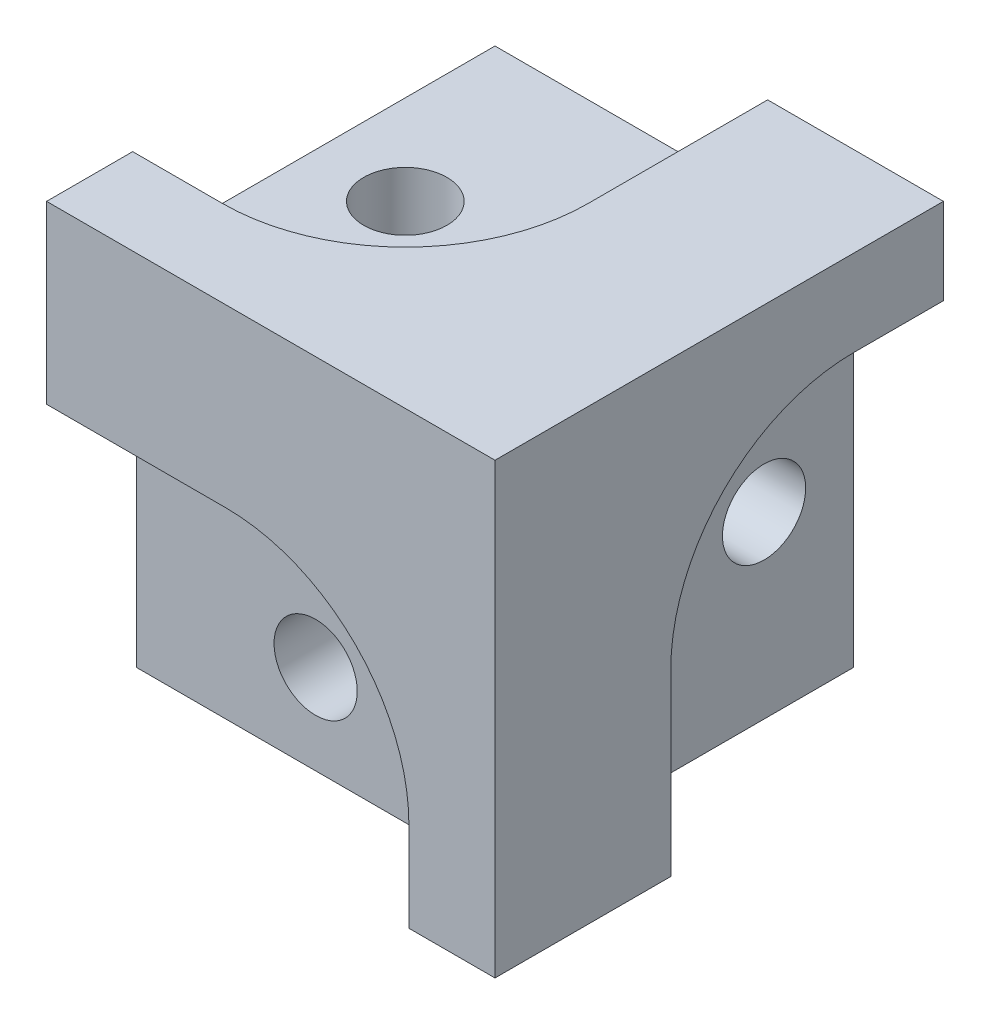
ISO-10303-21;
HEADER;
FILE_DESCRIPTION(('STEP AP214'),'2;1');
FILE_NAME('part.step','',(''),(''),'','','');
FILE_SCHEMA(('AUTOMOTIVE_DESIGN { 1 0 10303 214 1 1 1 1 }'));
ENDSEC;
DATA;
#1=APPLICATION_CONTEXT('core data for automotive mechanical design processes');
#2=APPLICATION_PROTOCOL_DEFINITION('international standard','automotive_design',2000,#1);
#3=PRODUCT_CONTEXT('',#1,'mechanical');
#4=PRODUCT('Part','Part','',(#3));
#5=PRODUCT_RELATED_PRODUCT_CATEGORY('part','',(#4));
#6=PRODUCT_DEFINITION_FORMATION('','',#4);
#7=PRODUCT_DEFINITION_CONTEXT('part definition',#1,'design');
#8=PRODUCT_DEFINITION('design','',#6,#7);
#9=PRODUCT_DEFINITION_SHAPE('','',#8);
#10=(LENGTH_UNIT() NAMED_UNIT(*) SI_UNIT(.MILLI.,.METRE.));
#11=(NAMED_UNIT(*) PLANE_ANGLE_UNIT() SI_UNIT($,.RADIAN.));
#12=(NAMED_UNIT(*) SI_UNIT($,.STERADIAN.) SOLID_ANGLE_UNIT());
#13=UNCERTAINTY_MEASURE_WITH_UNIT(LENGTH_MEASURE(1.E-05),#10,'distance_accuracy_value','');
#14=(GEOMETRIC_REPRESENTATION_CONTEXT(3) GLOBAL_UNCERTAINTY_ASSIGNED_CONTEXT((#13)) GLOBAL_UNIT_ASSIGNED_CONTEXT((#10,
#11,#12)) REPRESENTATION_CONTEXT('',''));
#15=CARTESIAN_POINT('',(0.,0.,0.));
#16=DIRECTION('',(0.,0.,1.));
#17=DIRECTION('',(1.,0.,0.));
#18=AXIS2_PLACEMENT_3D('',#15,#16,#17);
#19=CARTESIAN_POINT('',(7.9375,-7.9375,-7.9375));
#20=DIRECTION('',(1.,0.,0.));
#21=DIRECTION('',(0.,0.,-1.));
#22=AXIS2_PLACEMENT_3D('',#19,#20,#21);
#23=PLANE('',#22);
#24=DIRECTION('',(0.,0.,1.));
#25=VECTOR('',#24,1.);
#26=CARTESIAN_POINT('',(7.93750000000005,4.88949999999993,-4.76249999999998));
#27=LINE('',#26,#25);
#28=CARTESIAN_POINT('',(7.93750000000007,4.88949999999992,-7.93749999999998));
#29=VERTEX_POINT('',#28);
#30=CARTESIAN_POINT('',(7.93750000000005,4.88949999999993,-4.76249999999998));
#31=VERTEX_POINT('',#30);
#32=EDGE_CURVE('E170',#29,#31,#27,.T.);
#33=ORIENTED_EDGE('',*,*,#32,.F.);
#34=DIRECTION('',(0.,1.,0.));
#35=VECTOR('',#34,1.);
#36=CARTESIAN_POINT('',(7.9375,-7.9375,-7.9375));
#37=LINE('',#36,#35);
#38=CARTESIAN_POINT('',(7.9375,7.9375,-7.9375));
#39=VERTEX_POINT('',#38);
#40=EDGE_CURVE('E267',#29,#39,#37,.T.);
#41=ORIENTED_EDGE('',*,*,#40,.T.);
#42=DIRECTION('',(0.,0.,1.));
#43=VECTOR('',#42,1.);
#44=CARTESIAN_POINT('',(7.9375,7.9375,-7.9375));
#45=LINE('',#44,#43);
#46=CARTESIAN_POINT('',(7.9375,7.9375,7.9375));
#47=VERTEX_POINT('',#46);
#48=EDGE_CURVE('E276',#39,#47,#45,.T.);
#49=ORIENTED_EDGE('',*,*,#48,.T.);
#50=DIRECTION('',(0.,1.,0.));
#51=VECTOR('',#50,1.);
#52=CARTESIAN_POINT('',(7.9375,-7.9375,7.9375));
#53=LINE('',#52,#51);
#54=CARTESIAN_POINT('',(7.9375,-7.9375,7.9375));
#55=VERTEX_POINT('',#54);
#56=EDGE_CURVE('E255',#55,#47,#53,.T.);
#57=ORIENTED_EDGE('',*,*,#56,.F.);
#58=DIRECTION('',(0.,0.,1.));
#59=VECTOR('',#58,1.);
#60=CARTESIAN_POINT('',(7.9375,-7.9375,-7.9375));
#61=LINE('',#60,#59);
#62=CARTESIAN_POINT('',(7.93749999999995,-7.93750000000004,1.71450000000008));
#63=VERTEX_POINT('',#62);
#64=EDGE_CURVE('E11',#63,#55,#61,.T.);
#65=ORIENTED_EDGE('',*,*,#64,.F.);
#66=DIRECTION('',(0.,-1.,0.));
#67=VECTOR('',#66,1.);
#68=CARTESIAN_POINT('',(7.93749999999998,-1.58750000000003,1.71450000000005));
#69=LINE('',#68,#67);
#70=CARTESIAN_POINT('',(7.93749999999998,-1.58750000000003,1.71450000000005));
#71=VERTEX_POINT('',#70);
#72=EDGE_CURVE('E173',#71,#63,#69,.T.);
#73=ORIENTED_EDGE('',*,*,#72,.F.);
#74=CARTESIAN_POINT('',(7.93750000000002,-1.58750000000007,-4.76249999999995));
#75=DIRECTION('',(1.,0.,0.));
#76=DIRECTION('',(0.,-1.,0.));
#77=AXIS2_PLACEMENT_3D('',#74,#75,#76);
#78=CIRCLE('',#77,6.477);
#79=EDGE_CURVE('E157',#31,#71,#78,.T.);
#80=ORIENTED_EDGE('',*,*,#79,.F.);
#81=EDGE_LOOP('',(#33,#41,#49,#57,#65,#73,#80));
#82=FACE_BOUND('',#81,.T.);
#83=ADVANCED_FACE('F35',(#82),#23,.T.);
#84=CARTESIAN_POINT('',(-7.9375,-7.9375,-7.9375));
#85=DIRECTION('',(0.,-1.,0.));
#86=DIRECTION('',(0.,0.,-1.));
#87=AXIS2_PLACEMENT_3D('',#84,#85,#86);
#88=PLANE('',#87);
#89=DIRECTION('',(1.,0.,0.));
#90=VECTOR('',#89,1.);
#91=CARTESIAN_POINT('',(4.76249999999995,-7.93750000000002,1.71450000000007));
#92=LINE('',#91,#90);
#93=CARTESIAN_POINT('',(4.76249999999995,-7.93750000000002,1.71450000000007));
#94=VERTEX_POINT('',#93);
#95=EDGE_CURVE('E160',#94,#63,#92,.T.);
#96=ORIENTED_EDGE('',*,*,#95,.T.);
#97=ORIENTED_EDGE('',*,*,#64,.T.);
#98=DIRECTION('',(1.,0.,0.));
#99=VECTOR('',#98,1.);
#100=CARTESIAN_POINT('',(-7.9375,-7.9375,7.9375));
#101=LINE('',#100,#99);
#102=CARTESIAN_POINT('',(4.8895,-7.9375,7.9375));
#103=VERTEX_POINT('',#102);
#104=EDGE_CURVE('E264',#103,#55,#101,.T.);
#105=ORIENTED_EDGE('',*,*,#104,.F.);
#106=DIRECTION('',(0.,0.,1.));
#107=VECTOR('',#106,1.);
#108=CARTESIAN_POINT('',(4.8895,-7.9375,4.7625));
#109=LINE('',#108,#107);
#110=CARTESIAN_POINT('',(4.8895,-7.9375,4.7625));
#111=VERTEX_POINT('',#110);
#112=EDGE_CURVE('E245',#111,#103,#109,.T.);
#113=ORIENTED_EDGE('',*,*,#112,.F.);
#114=DIRECTION('',(1.,0.,0.));
#115=VECTOR('',#114,1.);
#116=CARTESIAN_POINT('',(-7.9375,-7.9375,4.7625));
#117=LINE('',#116,#115);
#118=CARTESIAN_POINT('',(-7.9375,-7.9375,4.7625));
#119=VERTEX_POINT('',#118);
#120=EDGE_CURVE('E231',#119,#111,#117,.T.);
#121=ORIENTED_EDGE('',*,*,#120,.F.);
#122=DIRECTION('',(0.,0.,1.));
#123=VECTOR('',#122,1.);
#124=CARTESIAN_POINT('',(-7.9375,-7.9375,-7.9375));
#125=LINE('',#124,#123);
#126=CARTESIAN_POINT('',(-7.9375,-7.9375,-7.9375));
#127=VERTEX_POINT('',#126);
#128=EDGE_CURVE('E43',#127,#119,#125,.T.);
#129=ORIENTED_EDGE('',*,*,#128,.F.);
#130=DIRECTION('',(1.,0.,0.));
#131=VECTOR('',#130,1.);
#132=CARTESIAN_POINT('',(-7.9375,-7.9375,-7.9375));
#133=LINE('',#132,#131);
#134=CARTESIAN_POINT('',(4.76250000000003,-7.9375,-7.9375));
#135=VERTEX_POINT('',#134);
#136=EDGE_CURVE('E274',#127,#135,#133,.T.);
#137=ORIENTED_EDGE('',*,*,#136,.T.);
#138=DIRECTION('',(0.,0.,-1.));
#139=VECTOR('',#138,1.);
#140=CARTESIAN_POINT('',(4.76249999999995,-7.93750000000002,1.71450000000007));
#141=LINE('',#140,#139);
#142=EDGE_CURVE('E51',#94,#135,#141,.T.);
#143=ORIENTED_EDGE('',*,*,#142,.F.);
#144=EDGE_LOOP('',(#96,#97,#105,#113,#121,#129,#137,#143));
#145=FACE_BOUND('',#144,.T.);
#146=CARTESIAN_POINT('',(-4.76249999999997,-7.93749999999999,-1.58749999999999));
#147=DIRECTION('',(0.,1.,0.));
#148=DIRECTION('',(0.,0.,1.));
#149=AXIS2_PLACEMENT_3D('',#146,#147,#148);
#150=CIRCLE('',#149,1.4732);
#151=CARTESIAN_POINT('',(-4.76249999999997,-7.93749999999999,-0.114299999999996));
#152=VERTEX_POINT('',#151);
#153=EDGE_CURVE('E218',#152,#152,#150,.T.);
#154=ORIENTED_EDGE('',*,*,#153,.T.);
#155=EDGE_LOOP('',(#154));
#156=FACE_BOUND('',#155,.T.);
#157=ADVANCED_FACE('F307',(#145,#156),#88,.T.);
#158=CARTESIAN_POINT('',(-7.9375,-7.9375,-7.9375));
#159=DIRECTION('',(-1.,0.,0.));
#160=DIRECTION('',(0.,0.,1.));
#161=AXIS2_PLACEMENT_3D('',#158,#159,#160);
#162=PLANE('',#161);
#163=DIRECTION('',(0.,1.,0.));
#164=VECTOR('',#163,1.);
#165=CARTESIAN_POINT('',(-7.9375,4.76250000000003,4.88949999999997));
#166=LINE('',#165,#164);
#167=CARTESIAN_POINT('',(-7.9375,4.76250000000003,4.88949999999997));
#168=VERTEX_POINT('',#167);
#169=CARTESIAN_POINT('',(-7.93749999999999,7.93750000000003,4.88949999999996));
#170=VERTEX_POINT('',#169);
#171=EDGE_CURVE('E209',#168,#170,#166,.T.);
#172=ORIENTED_EDGE('',*,*,#171,.F.);
#173=DIRECTION('',(0.,0.,1.));
#174=VECTOR('',#173,1.);
#175=CARTESIAN_POINT('',(-7.93749999999997,4.7625,-7.93750000000003));
#176=LINE('',#175,#174);
#177=CARTESIAN_POINT('',(-7.93749999999997,4.7625,-7.93750000000003));
#178=VERTEX_POINT('',#177);
#179=EDGE_CURVE('E193',#178,#168,#176,.T.);
#180=ORIENTED_EDGE('',*,*,#179,.F.);
#181=DIRECTION('',(0.,-1.,0.));
#182=VECTOR('',#181,1.);
#183=CARTESIAN_POINT('',(-7.9375,-7.9375,-7.9375));
#184=LINE('',#183,#182);
#185=EDGE_CURVE('E272',#178,#127,#184,.T.);
#186=ORIENTED_EDGE('',*,*,#185,.T.);
#187=ORIENTED_EDGE('',*,*,#128,.T.);
#188=DIRECTION('',(0.,-1.,0.));
#189=VECTOR('',#188,1.);
#190=CARTESIAN_POINT('',(-7.9375,1.7145,4.7625));
#191=LINE('',#190,#189);
#192=CARTESIAN_POINT('',(-7.9375,1.7145,4.7625));
#193=VERTEX_POINT('',#192);
#194=EDGE_CURVE('E229',#193,#119,#191,.T.);
#195=ORIENTED_EDGE('',*,*,#194,.F.);
#196=DIRECTION('',(0.,0.,1.));
#197=VECTOR('',#196,1.);
#198=CARTESIAN_POINT('',(-7.9375,1.7145,4.7625));
#199=LINE('',#198,#197);
#200=CARTESIAN_POINT('',(-7.9375,1.7145,7.9375));
#201=VERTEX_POINT('',#200);
#202=EDGE_CURVE('E247',#193,#201,#199,.T.);
#203=ORIENTED_EDGE('',*,*,#202,.T.);
#204=DIRECTION('',(0.,-1.,0.));
#205=VECTOR('',#204,1.);
#206=CARTESIAN_POINT('',(-7.9375,-7.9375,7.9375));
#207=LINE('',#206,#205);
#208=CARTESIAN_POINT('',(-7.9375,7.9375,7.9375));
#209=VERTEX_POINT('',#208);
#210=EDGE_CURVE('E261',#209,#201,#207,.T.);
#211=ORIENTED_EDGE('',*,*,#210,.F.);
#212=DIRECTION('',(0.,0.,1.));
#213=VECTOR('',#212,1.);
#214=CARTESIAN_POINT('',(-7.9375,7.9375,-7.9375));
#215=LINE('',#214,#213);
#216=EDGE_CURVE('E280',#170,#209,#215,.T.);
#217=ORIENTED_EDGE('',*,*,#216,.F.);
#218=EDGE_LOOP('',(#172,#180,#186,#187,#195,#203,#211,#217));
#219=FACE_BOUND('',#218,.T.);
#220=CARTESIAN_POINT('',(-7.93749999999998,-1.58750000000007,-4.76250000000003));
#221=DIRECTION('',(1.,0.,0.));
#222=DIRECTION('',(0.,0.,-1.));
#223=AXIS2_PLACEMENT_3D('',#220,#221,#222);
#224=CIRCLE('',#223,1.4732);
#225=CARTESIAN_POINT('',(-7.93749999999998,-1.58750000000007,-6.23570000000003));
#226=VERTEX_POINT('',#225);
#227=EDGE_CURVE('E215',#226,#226,#224,.T.);
#228=ORIENTED_EDGE('',*,*,#227,.T.);
#229=EDGE_LOOP('',(#228));
#230=FACE_BOUND('',#229,.T.);
#231=ADVANCED_FACE('F312',(#219,#230),#162,.T.);
#232=CARTESIAN_POINT('',(-7.9375,7.9375,-7.9375));
#233=DIRECTION('',(0.,1.,0.));
#234=DIRECTION('',(0.,0.,1.));
#235=AXIS2_PLACEMENT_3D('',#232,#233,#234);
#236=PLANE('',#235);
#237=DIRECTION('',(1.,0.,0.));
#238=VECTOR('',#237,1.);
#239=CARTESIAN_POINT('',(-4.76249999999999,7.93750000000003,4.88949999999997));
#240=LINE('',#239,#238);
#241=CARTESIAN_POINT('',(-4.76249999999999,7.93750000000003,4.88949999999997));
#242=VERTEX_POINT('',#241);
#243=EDGE_CURVE('E189',#170,#242,#240,.T.);
#244=ORIENTED_EDGE('',*,*,#243,.F.);
#245=ORIENTED_EDGE('',*,*,#216,.T.);
#246=DIRECTION('',(-1.,0.,0.));
#247=VECTOR('',#246,1.);
#248=CARTESIAN_POINT('',(-7.9375,7.9375,7.9375));
#249=LINE('',#248,#247);
#250=EDGE_CURVE('E258',#47,#209,#249,.T.);
#251=ORIENTED_EDGE('',*,*,#250,.F.);
#252=ORIENTED_EDGE('',*,*,#48,.F.);
#253=DIRECTION('',(-1.,0.,0.));
#254=VECTOR('',#253,1.);
#255=CARTESIAN_POINT('',(-7.9375,7.9375,-7.9375));
#256=LINE('',#255,#254);
#257=CARTESIAN_POINT('',(1.71450000000004,7.93749999999997,-7.93750000000002));
#258=VERTEX_POINT('',#257);
#259=EDGE_CURVE('E269',#39,#258,#256,.T.);
#260=ORIENTED_EDGE('',*,*,#259,.T.);
#261=DIRECTION('',(0.,0.,-1.));
#262=VECTOR('',#261,1.);
#263=CARTESIAN_POINT('',(1.71450000000003,7.93749999999999,-1.58750000000002));
#264=LINE('',#263,#262);
#265=CARTESIAN_POINT('',(1.71450000000003,7.93749999999999,-1.58750000000002));
#266=VERTEX_POINT('',#265);
#267=EDGE_CURVE('E202',#266,#258,#264,.T.);
#268=ORIENTED_EDGE('',*,*,#267,.F.);
#269=CARTESIAN_POINT('',(-4.76249999999997,7.93750000000001,-1.58750000000003));
#270=DIRECTION('',(0.,1.,0.));
#271=DIRECTION('',(0.,0.,-1.));
#272=AXIS2_PLACEMENT_3D('',#269,#270,#271);
#273=CIRCLE('',#272,6.477);
#274=EDGE_CURVE('E199',#242,#266,#273,.T.);
#275=ORIENTED_EDGE('',*,*,#274,.F.);
#276=EDGE_LOOP('',(#244,#245,#251,#252,#260,#268,#275));
#277=FACE_BOUND('',#276,.T.);
#278=ADVANCED_FACE('F328',(#277),#236,.T.);
#279=CARTESIAN_POINT('',(0.,0.,-7.9375));
#280=DIRECTION('',(0.,0.,-1.));
#281=DIRECTION('',(-1.,0.,0.));
#282=AXIS2_PLACEMENT_3D('',#279,#280,#281);
#283=PLANE('',#282);
#284=DIRECTION('',(1.,0.,0.));
#285=VECTOR('',#284,1.);
#286=CARTESIAN_POINT('',(4.76250000000007,4.88949999999993,-7.9375));
#287=LINE('',#286,#285);
#288=CARTESIAN_POINT('',(4.76250000000007,4.88949999999993,-7.9375));
#289=VERTEX_POINT('',#288);
#290=EDGE_CURVE('E184',#289,#29,#287,.T.);
#291=ORIENTED_EDGE('',*,*,#290,.F.);
#292=DIRECTION('',(0.,1.,0.));
#293=VECTOR('',#292,1.);
#294=CARTESIAN_POINT('',(4.7625,-7.93750000000007,-7.93749999999993));
#295=LINE('',#294,#293);
#296=EDGE_CURVE('E177',#135,#289,#295,.T.);
#297=ORIENTED_EDGE('',*,*,#296,.F.);
#298=ORIENTED_EDGE('',*,*,#136,.F.);
#299=ORIENTED_EDGE('',*,*,#185,.F.);
#300=DIRECTION('',(-1.,0.,0.));
#301=VECTOR('',#300,1.);
#302=CARTESIAN_POINT('',(1.71450000000003,4.76249999999997,-7.93750000000001));
#303=LINE('',#302,#301);
#304=CARTESIAN_POINT('',(1.71450000000003,4.76249999999997,-7.9375));
#305=VERTEX_POINT('',#304);
#306=EDGE_CURVE('E191',#305,#178,#303,.T.);
#307=ORIENTED_EDGE('',*,*,#306,.F.);
#308=DIRECTION('',(0.,1.,0.));
#309=VECTOR('',#308,1.);
#310=CARTESIAN_POINT('',(1.71450000000003,4.76249999999997,-7.93750000000001));
#311=LINE('',#310,#309);
#312=EDGE_CURVE('E211',#305,#258,#311,.T.);
#313=ORIENTED_EDGE('',*,*,#312,.T.);
#314=ORIENTED_EDGE('',*,*,#259,.F.);
#315=ORIENTED_EDGE('',*,*,#40,.F.);
#316=EDGE_LOOP('',(#291,#297,#298,#299,#307,#313,#314,#315));
#317=FACE_BOUND('',#316,.T.);
#318=CARTESIAN_POINT('',(-1.5875,-4.7625,-7.9375));
#319=DIRECTION('',(0.,0.,1.));
#320=DIRECTION('',(1.,0.,0.));
#321=AXIS2_PLACEMENT_3D('',#318,#319,#320);
#322=CIRCLE('',#321,1.4732);
#323=CARTESIAN_POINT('',(-0.114300000000004,-4.7625,-7.9375));
#324=VERTEX_POINT('',#323);
#325=EDGE_CURVE('E252',#324,#324,#322,.T.);
#326=ORIENTED_EDGE('',*,*,#325,.T.);
#327=EDGE_LOOP('',(#326));
#328=FACE_BOUND('',#327,.T.);
#329=ADVANCED_FACE('F322',(#317,#328),#283,.T.);
#330=CARTESIAN_POINT('',(0.,0.,7.9375));
#331=DIRECTION('',(0.,0.,-1.));
#332=DIRECTION('',(-1.,0.,0.));
#333=AXIS2_PLACEMENT_3D('',#330,#331,#332);
#334=PLANE('',#333);
#335=CARTESIAN_POINT('',(-1.5875,-4.7625,7.9375));
#336=DIRECTION('',(0.,0.,1.));
#337=DIRECTION('',(-1.,0.,0.));
#338=AXIS2_PLACEMENT_3D('',#335,#336,#337);
#339=CIRCLE('',#338,6.477);
#340=CARTESIAN_POINT('',(4.8895,-4.7625,7.9375));
#341=VERTEX_POINT('',#340);
#342=CARTESIAN_POINT('',(-1.5875,1.7145,7.9375));
#343=VERTEX_POINT('',#342);
#344=EDGE_CURVE('E221',#341,#343,#339,.T.);
#345=ORIENTED_EDGE('',*,*,#344,.F.);
#346=DIRECTION('',(0.,1.,0.));
#347=VECTOR('',#346,1.);
#348=CARTESIAN_POINT('',(4.8895,-4.7625,7.9375));
#349=LINE('',#348,#347);
#350=EDGE_CURVE('E226',#103,#341,#349,.T.);
#351=ORIENTED_EDGE('',*,*,#350,.F.);
#352=ORIENTED_EDGE('',*,*,#104,.T.);
#353=ORIENTED_EDGE('',*,*,#56,.T.);
#354=ORIENTED_EDGE('',*,*,#250,.T.);
#355=ORIENTED_EDGE('',*,*,#210,.T.);
#356=DIRECTION('',(-1.,0.,0.));
#357=VECTOR('',#356,1.);
#358=CARTESIAN_POINT('',(-1.5875,1.7145,7.9375));
#359=LINE('',#358,#357);
#360=EDGE_CURVE('E238',#343,#201,#359,.T.);
#361=ORIENTED_EDGE('',*,*,#360,.F.);
#362=EDGE_LOOP('',(#345,#351,#352,#353,#354,#355,#361));
#363=FACE_BOUND('',#362,.T.);
#364=ADVANCED_FACE('F335',(#363),#334,.F.);
#365=CARTESIAN_POINT('',(-1.5875,-4.7625,7.9375));
#366=DIRECTION('',(0.,0.,1.));
#367=DIRECTION('',(1.,0.,0.));
#368=AXIS2_PLACEMENT_3D('',#365,#366,#367);
#369=CYLINDRICAL_SURFACE('',#368,1.4732);
#370=CARTESIAN_POINT('',(-1.5875,-4.7625,4.7625));
#371=DIRECTION('',(0.,0.,-1.));
#372=DIRECTION('',(-1.,0.,0.));
#373=AXIS2_PLACEMENT_3D('',#370,#371,#372);
#374=CIRCLE('',#373,1.4732);
#375=CARTESIAN_POINT('',(-3.0607,-4.7625,4.7625));
#376=VERTEX_POINT('',#375);
#377=EDGE_CURVE('E244',#376,#376,#374,.F.);
#378=ORIENTED_EDGE('',*,*,#377,.T.);
#379=EDGE_LOOP('',(#378));
#380=FACE_BOUND('',#379,.T.);
#381=ORIENTED_EDGE('',*,*,#325,.F.);
#382=EDGE_LOOP('',(#381));
#383=FACE_BOUND('',#382,.T.);
#384=ADVANCED_FACE('F373',(#380,#383),#369,.F.);
#385=CARTESIAN_POINT('',(-1.5875,-4.7625,4.7625));
#386=DIRECTION('',(0.,0.,-1.));
#387=DIRECTION('',(-1.,0.,0.));
#388=AXIS2_PLACEMENT_3D('',#385,#386,#387);
#389=PLANE('',#388);
#390=CARTESIAN_POINT('',(-1.5875,-4.7625,4.7625));
#391=DIRECTION('',(0.,0.,1.));
#392=DIRECTION('',(-1.,0.,0.));
#393=AXIS2_PLACEMENT_3D('',#390,#391,#392);
#394=CIRCLE('',#393,6.477);
#395=CARTESIAN_POINT('',(4.8895,-4.7625,4.7625));
#396=VERTEX_POINT('',#395);
#397=CARTESIAN_POINT('',(-1.5875,1.7145,4.7625));
#398=VERTEX_POINT('',#397);
#399=EDGE_CURVE('E222',#396,#398,#394,.T.);
#400=ORIENTED_EDGE('',*,*,#399,.T.);
#401=DIRECTION('',(-1.,0.,0.));
#402=VECTOR('',#401,1.);
#403=CARTESIAN_POINT('',(-1.5875,1.7145,4.7625));
#404=LINE('',#403,#402);
#405=EDGE_CURVE('E225',#398,#193,#404,.T.);
#406=ORIENTED_EDGE('',*,*,#405,.T.);
#407=ORIENTED_EDGE('',*,*,#194,.T.);
#408=ORIENTED_EDGE('',*,*,#120,.T.);
#409=DIRECTION('',(0.,1.,0.));
#410=VECTOR('',#409,1.);
#411=CARTESIAN_POINT('',(4.8895,-4.7625,4.7625));
#412=LINE('',#411,#410);
#413=EDGE_CURVE('E233',#111,#396,#412,.T.);
#414=ORIENTED_EDGE('',*,*,#413,.T.);
#415=EDGE_LOOP('',(#400,#406,#407,#408,#414));
#416=FACE_BOUND('',#415,.T.);
#417=ORIENTED_EDGE('',*,*,#377,.F.);
#418=EDGE_LOOP('',(#417));
#419=FACE_BOUND('',#418,.T.);
#420=ADVANCED_FACE('F369',(#416,#419),#389,.F.);
#421=CARTESIAN_POINT('',(-1.5875,-4.7625,4.7625));
#422=DIRECTION('',(0.,0.,1.));
#423=DIRECTION('',(1.,0.,0.));
#424=AXIS2_PLACEMENT_3D('',#421,#422,#423);
#425=CYLINDRICAL_SURFACE('',#424,6.477);
#426=ORIENTED_EDGE('',*,*,#344,.T.);
#427=DIRECTION('',(0.,0.,1.));
#428=VECTOR('',#427,1.);
#429=CARTESIAN_POINT('',(-1.5875,1.7145,4.7625));
#430=LINE('',#429,#428);
#431=EDGE_CURVE('E236',#398,#343,#430,.T.);
#432=ORIENTED_EDGE('',*,*,#431,.F.);
#433=ORIENTED_EDGE('',*,*,#399,.F.);
#434=DIRECTION('',(0.,0.,1.));
#435=VECTOR('',#434,1.);
#436=CARTESIAN_POINT('',(4.8895,-4.7625,4.7625));
#437=LINE('',#436,#435);
#438=EDGE_CURVE('E242',#396,#341,#437,.T.);
#439=ORIENTED_EDGE('',*,*,#438,.T.);
#440=EDGE_LOOP('',(#426,#432,#433,#439));
#441=FACE_BOUND('',#440,.T.);
#442=ADVANCED_FACE('F372',(#441),#425,.F.);
#443=CARTESIAN_POINT('',(4.8895,-4.7625,4.7625));
#444=DIRECTION('',(1.,0.,0.));
#445=DIRECTION('',(0.,0.,-1.));
#446=AXIS2_PLACEMENT_3D('',#443,#444,#445);
#447=PLANE('',#446);
#448=ORIENTED_EDGE('',*,*,#350,.T.);
#449=ORIENTED_EDGE('',*,*,#438,.F.);
#450=ORIENTED_EDGE('',*,*,#413,.F.);
#451=ORIENTED_EDGE('',*,*,#112,.T.);
#452=EDGE_LOOP('',(#448,#449,#450,#451));
#453=FACE_BOUND('',#452,.T.);
#454=ADVANCED_FACE('F375',(#453),#447,.F.);
#455=CARTESIAN_POINT('',(-1.5875,1.7145,4.7625));
#456=DIRECTION('',(0.,1.,0.));
#457=DIRECTION('',(-1.,0.,0.));
#458=AXIS2_PLACEMENT_3D('',#455,#456,#457);
#459=PLANE('',#458);
#460=ORIENTED_EDGE('',*,*,#360,.T.);
#461=ORIENTED_EDGE('',*,*,#202,.F.);
#462=ORIENTED_EDGE('',*,*,#405,.F.);
#463=ORIENTED_EDGE('',*,*,#431,.T.);
#464=EDGE_LOOP('',(#460,#461,#462,#463));
#465=FACE_BOUND('',#464,.T.);
#466=ADVANCED_FACE('F368',(#465),#459,.F.);
#467=CARTESIAN_POINT('',(-4.76249999999997,7.93750000000001,-1.58750000000003));
#468=DIRECTION('',(0.,1.,0.));
#469=DIRECTION('',(0.,0.,1.));
#470=AXIS2_PLACEMENT_3D('',#467,#468,#469);
#471=CYLINDRICAL_SURFACE('',#470,1.4732);
#472=CARTESIAN_POINT('',(-4.76249999999997,4.76250000000001,-1.58750000000003));
#473=DIRECTION('',(0.,-1.,0.));
#474=DIRECTION('',(1.,0.,0.));
#475=AXIS2_PLACEMENT_3D('',#472,#473,#474);
#476=CIRCLE('',#475,1.4732);
#477=CARTESIAN_POINT('',(-3.28929999999998,4.7625,-1.58750000000003));
#478=VERTEX_POINT('',#477);
#479=EDGE_CURVE('E208',#478,#478,#476,.F.);
#480=ORIENTED_EDGE('',*,*,#479,.T.);
#481=EDGE_LOOP('',(#480));
#482=FACE_BOUND('',#481,.T.);
#483=ORIENTED_EDGE('',*,*,#153,.F.);
#484=EDGE_LOOP('',(#483));
#485=FACE_BOUND('',#484,.T.);
#486=ADVANCED_FACE('F287',(#482,#485),#471,.F.);
#487=CARTESIAN_POINT('',(7.93750000000002,-1.58750000000007,-4.76249999999995));
#488=DIRECTION('',(1.,0.,0.));
#489=DIRECTION('',(0.,0.,-1.));
#490=AXIS2_PLACEMENT_3D('',#487,#488,#489);
#491=CYLINDRICAL_SURFACE('',#490,1.4732);
#492=CARTESIAN_POINT('',(4.76250000000002,-1.58750000000007,-4.76249999999997));
#493=DIRECTION('',(-1.,0.,0.));
#494=DIRECTION('',(0.,-1.,0.));
#495=AXIS2_PLACEMENT_3D('',#492,#493,#494);
#496=CIRCLE('',#495,1.4732);
#497=CARTESIAN_POINT('',(4.76250000000001,-3.06070000000006,-4.76249999999997));
#498=VERTEX_POINT('',#497);
#499=EDGE_CURVE('E38',#498,#498,#496,.F.);
#500=ORIENTED_EDGE('',*,*,#499,.T.);
#501=EDGE_LOOP('',(#500));
#502=FACE_BOUND('',#501,.T.);
#503=ORIENTED_EDGE('',*,*,#227,.F.);
#504=EDGE_LOOP('',(#503));
#505=FACE_BOUND('',#504,.T.);
#506=ADVANCED_FACE('F293',(#502,#505),#491,.F.);
#507=CARTESIAN_POINT('',(-4.76249999999998,4.76250000000001,-1.58750000000003));
#508=DIRECTION('',(0.,-1.,0.));
#509=DIRECTION('',(0.,0.,-1.));
#510=AXIS2_PLACEMENT_3D('',#507,#508,#509);
#511=PLANE('',#510);
#512=CARTESIAN_POINT('',(-4.76249999999998,4.76250000000001,-1.58750000000003));
#513=DIRECTION('',(0.,1.,0.));
#514=DIRECTION('',(0.,0.,-1.));
#515=AXIS2_PLACEMENT_3D('',#512,#513,#514);
#516=CIRCLE('',#515,6.477);
#517=CARTESIAN_POINT('',(-4.7625,4.76250000000003,4.88949999999997));
#518=VERTEX_POINT('',#517);
#519=CARTESIAN_POINT('',(1.71450000000002,4.76249999999999,-1.58750000000001));
#520=VERTEX_POINT('',#519);
#521=EDGE_CURVE('E187',#518,#520,#516,.T.);
#522=ORIENTED_EDGE('',*,*,#521,.T.);
#523=DIRECTION('',(0.,0.,-1.));
#524=VECTOR('',#523,1.);
#525=CARTESIAN_POINT('',(1.71450000000002,4.76249999999999,-1.58750000000001));
#526=LINE('',#525,#524);
#527=EDGE_CURVE('E59',#520,#305,#526,.T.);
#528=ORIENTED_EDGE('',*,*,#527,.T.);
#529=ORIENTED_EDGE('',*,*,#306,.T.);
#530=ORIENTED_EDGE('',*,*,#179,.T.);
#531=DIRECTION('',(1.,0.,0.));
#532=VECTOR('',#531,1.);
#533=CARTESIAN_POINT('',(-4.7625,4.76250000000003,4.88949999999997));
#534=LINE('',#533,#532);
#535=EDGE_CURVE('E195',#168,#518,#534,.T.);
#536=ORIENTED_EDGE('',*,*,#535,.T.);
#537=EDGE_LOOP('',(#522,#528,#529,#530,#536));
#538=FACE_BOUND('',#537,.T.);
#539=ORIENTED_EDGE('',*,*,#479,.F.);
#540=EDGE_LOOP('',(#539));
#541=FACE_BOUND('',#540,.T.);
#542=ADVANCED_FACE('F290',(#538,#541),#511,.F.);
#543=CARTESIAN_POINT('',(-4.76249999999998,4.76250000000001,-1.58750000000003));
#544=DIRECTION('',(0.,1.,0.));
#545=DIRECTION('',(-1.,0.,0.));
#546=AXIS2_PLACEMENT_3D('',#543,#544,#545);
#547=CYLINDRICAL_SURFACE('',#546,6.477);
#548=ORIENTED_EDGE('',*,*,#274,.T.);
#549=DIRECTION('',(0.,1.,0.));
#550=VECTOR('',#549,1.);
#551=CARTESIAN_POINT('',(1.71450000000002,4.76249999999999,-1.58750000000001));
#552=LINE('',#551,#550);
#553=EDGE_CURVE('E198',#520,#266,#552,.T.);
#554=ORIENTED_EDGE('',*,*,#553,.F.);
#555=ORIENTED_EDGE('',*,*,#521,.F.);
#556=DIRECTION('',(0.,1.,0.));
#557=VECTOR('',#556,1.);
#558=CARTESIAN_POINT('',(-4.7625,4.76250000000003,4.88949999999997));
#559=LINE('',#558,#557);
#560=EDGE_CURVE('E206',#518,#242,#559,.T.);
#561=ORIENTED_EDGE('',*,*,#560,.T.);
#562=EDGE_LOOP('',(#548,#554,#555,#561));
#563=FACE_BOUND('',#562,.T.);
#564=ADVANCED_FACE('F292',(#563),#547,.F.);
#565=CARTESIAN_POINT('',(-4.7625,4.76250000000003,4.88949999999997));
#566=DIRECTION('',(0.,0.,1.));
#567=DIRECTION('',(1.,0.,0.));
#568=AXIS2_PLACEMENT_3D('',#565,#566,#567);
#569=PLANE('',#568);
#570=ORIENTED_EDGE('',*,*,#243,.T.);
#571=ORIENTED_EDGE('',*,*,#560,.F.);
#572=ORIENTED_EDGE('',*,*,#535,.F.);
#573=ORIENTED_EDGE('',*,*,#171,.T.);
#574=EDGE_LOOP('',(#570,#571,#572,#573));
#575=FACE_BOUND('',#574,.T.);
#576=ADVANCED_FACE('F299',(#575),#569,.F.);
#577=CARTESIAN_POINT('',(1.71450000000002,4.76249999999999,-1.58750000000001));
#578=DIRECTION('',(1.,0.,0.));
#579=DIRECTION('',(0.,1.,0.));
#580=AXIS2_PLACEMENT_3D('',#577,#578,#579);
#581=PLANE('',#580);
#582=ORIENTED_EDGE('',*,*,#267,.T.);
#583=ORIENTED_EDGE('',*,*,#312,.F.);
#584=ORIENTED_EDGE('',*,*,#527,.F.);
#585=ORIENTED_EDGE('',*,*,#553,.T.);
#586=EDGE_LOOP('',(#582,#583,#584,#585));
#587=FACE_BOUND('',#586,.T.);
#588=ADVANCED_FACE('F355',(#587),#581,.F.);
#589=CARTESIAN_POINT('',(4.76250000000002,-1.58750000000005,-4.76249999999997));
#590=DIRECTION('',(-1.,0.,0.));
#591=DIRECTION('',(0.,-1.,0.));
#592=AXIS2_PLACEMENT_3D('',#589,#590,#591);
#593=PLANE('',#592);
#594=CARTESIAN_POINT('',(4.76250000000002,-1.58750000000005,-4.76249999999997));
#595=DIRECTION('',(1.,0.,0.));
#596=DIRECTION('',(0.,-1.,0.));
#597=AXIS2_PLACEMENT_3D('',#594,#595,#596);
#598=CIRCLE('',#597,6.477);
#599=CARTESIAN_POINT('',(4.76250000000005,4.88949999999995,-4.7625));
#600=VERTEX_POINT('',#599);
#601=CARTESIAN_POINT('',(4.76249999999998,-1.58750000000002,1.71450000000003));
#602=VERTEX_POINT('',#601);
#603=EDGE_CURVE('E154',#600,#602,#598,.T.);
#604=ORIENTED_EDGE('',*,*,#603,.T.);
#605=DIRECTION('',(0.,-1.,0.));
#606=VECTOR('',#605,1.);
#607=CARTESIAN_POINT('',(4.76249999999998,-1.58750000000002,1.71450000000003));
#608=LINE('',#607,#606);
#609=EDGE_CURVE('E163',#602,#94,#608,.T.);
#610=ORIENTED_EDGE('',*,*,#609,.T.);
#611=ORIENTED_EDGE('',*,*,#142,.T.);
#612=ORIENTED_EDGE('',*,*,#296,.T.);
#613=DIRECTION('',(0.,0.,1.));
#614=VECTOR('',#613,1.);
#615=CARTESIAN_POINT('',(4.76250000000005,4.88949999999995,-4.7625));
#616=LINE('',#615,#614);
#617=EDGE_CURVE('E161',#289,#600,#616,.T.);
#618=ORIENTED_EDGE('',*,*,#617,.T.);
#619=EDGE_LOOP('',(#604,#610,#611,#612,#618));
#620=FACE_BOUND('',#619,.T.);
#621=ORIENTED_EDGE('',*,*,#499,.F.);
#622=EDGE_LOOP('',(#621));
#623=FACE_BOUND('',#622,.T.);
#624=ADVANCED_FACE('F167',(#620,#623),#593,.F.);
#625=CARTESIAN_POINT('',(4.76250000000002,-1.58750000000005,-4.76249999999997));
#626=DIRECTION('',(1.,0.,0.));
#627=DIRECTION('',(0.,1.,0.));
#628=AXIS2_PLACEMENT_3D('',#625,#626,#627);
#629=CYLINDRICAL_SURFACE('',#628,6.477);
#630=ORIENTED_EDGE('',*,*,#79,.T.);
#631=DIRECTION('',(1.,0.,0.));
#632=VECTOR('',#631,1.);
#633=CARTESIAN_POINT('',(4.76249999999998,-1.58750000000002,1.71450000000003));
#634=LINE('',#633,#632);
#635=EDGE_CURVE('E150',#602,#71,#634,.T.);
#636=ORIENTED_EDGE('',*,*,#635,.F.);
#637=ORIENTED_EDGE('',*,*,#603,.F.);
#638=DIRECTION('',(1.,0.,0.));
#639=VECTOR('',#638,1.);
#640=CARTESIAN_POINT('',(4.76250000000005,4.88949999999995,-4.7625));
#641=LINE('',#640,#639);
#642=EDGE_CURVE('E182',#600,#31,#641,.T.);
#643=ORIENTED_EDGE('',*,*,#642,.T.);
#644=EDGE_LOOP('',(#630,#636,#637,#643));
#645=FACE_BOUND('',#644,.T.);
#646=ADVANCED_FACE('F152',(#645),#629,.F.);
#647=CARTESIAN_POINT('',(4.76250000000005,4.88949999999995,-4.7625));
#648=DIRECTION('',(0.,1.,0.));
#649=DIRECTION('',(-1.,0.,0.));
#650=AXIS2_PLACEMENT_3D('',#647,#648,#649);
#651=PLANE('',#650);
#652=ORIENTED_EDGE('',*,*,#32,.T.);
#653=ORIENTED_EDGE('',*,*,#642,.F.);
#654=ORIENTED_EDGE('',*,*,#617,.F.);
#655=ORIENTED_EDGE('',*,*,#290,.T.);
#656=EDGE_LOOP('',(#652,#653,#654,#655));
#657=FACE_BOUND('',#656,.T.);
#658=ADVANCED_FACE('F345',(#657),#651,.F.);
#659=CARTESIAN_POINT('',(4.76249999999998,-1.58750000000002,1.71450000000003));
#660=DIRECTION('',(0.,0.,1.));
#661=DIRECTION('',(1.,0.,0.));
#662=AXIS2_PLACEMENT_3D('',#659,#660,#661);
#663=PLANE('',#662);
#664=ORIENTED_EDGE('',*,*,#72,.T.);
#665=ORIENTED_EDGE('',*,*,#95,.F.);
#666=ORIENTED_EDGE('',*,*,#609,.F.);
#667=ORIENTED_EDGE('',*,*,#635,.T.);
#668=EDGE_LOOP('',(#664,#665,#666,#667));
#669=FACE_BOUND('',#668,.T.);
#670=ADVANCED_FACE('F164',(#669),#663,.F.);
#671=CLOSED_SHELL('',(#83,#157,#231,#278,#329,#364,#384,#420,#442,#454,#466,#486,#506,#542,#564,
#576,#588,#624,#646,#658,#670));
#672=MANIFOLD_SOLID_BREP('B2',#671);
#673=ADVANCED_BREP_SHAPE_REPRESENTATION('',(#18,#672),#14);
#674=SHAPE_DEFINITION_REPRESENTATION(#9,#673);
ENDSEC;
END-ISO-10303-21;
